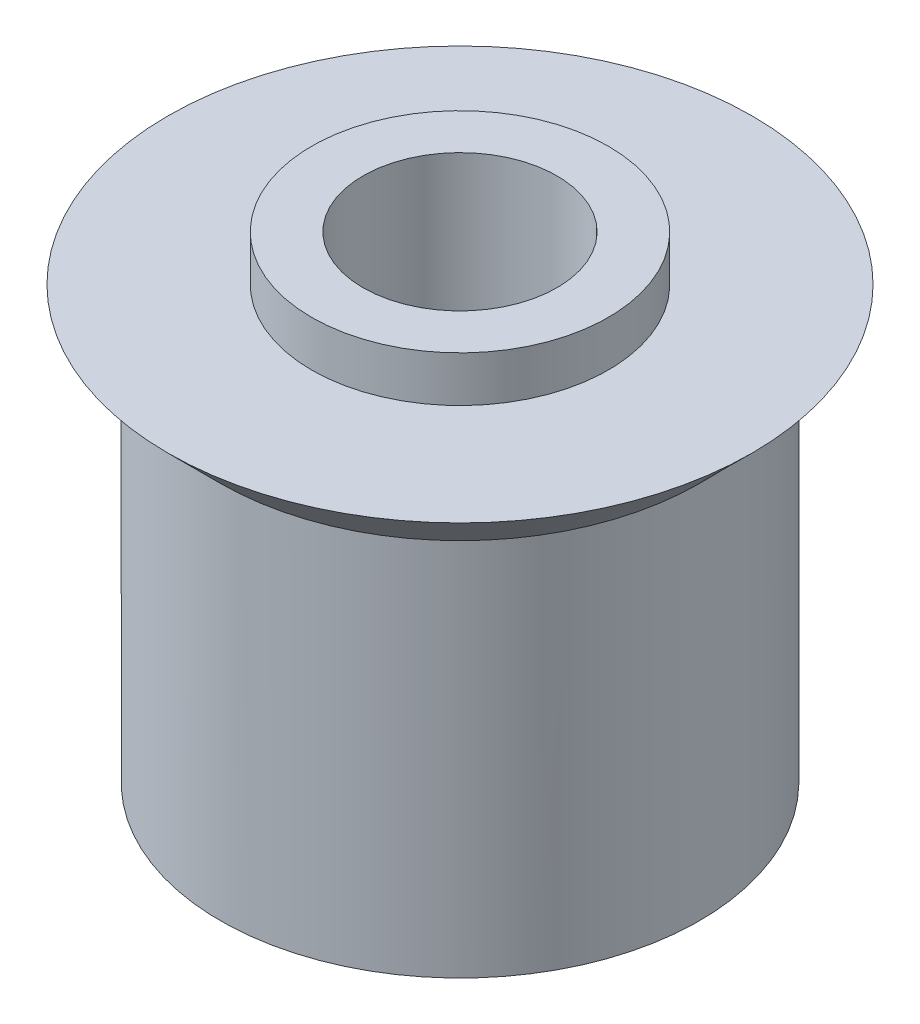
ISO-10303-21;
HEADER;
FILE_DESCRIPTION(('STEP AP214'),'2;1');
FILE_NAME('part.step','',(''),(''),'','','');
FILE_SCHEMA(('AUTOMOTIVE_DESIGN { 1 0 10303 214 1 1 1 1 }'));
ENDSEC;
DATA;
#1=APPLICATION_CONTEXT('core data for automotive mechanical design processes');
#2=APPLICATION_PROTOCOL_DEFINITION('international standard','automotive_design',2000,#1);
#3=PRODUCT_CONTEXT('',#1,'mechanical');
#4=PRODUCT('Part','Part','',(#3));
#5=PRODUCT_RELATED_PRODUCT_CATEGORY('part','',(#4));
#6=PRODUCT_DEFINITION_FORMATION('','',#4);
#7=PRODUCT_DEFINITION_CONTEXT('part definition',#1,'design');
#8=PRODUCT_DEFINITION('design','',#6,#7);
#9=PRODUCT_DEFINITION_SHAPE('','',#8);
#10=(LENGTH_UNIT() NAMED_UNIT(*) SI_UNIT(.MILLI.,.METRE.));
#11=(NAMED_UNIT(*) PLANE_ANGLE_UNIT() SI_UNIT($,.RADIAN.));
#12=(NAMED_UNIT(*) SI_UNIT($,.STERADIAN.) SOLID_ANGLE_UNIT());
#13=UNCERTAINTY_MEASURE_WITH_UNIT(LENGTH_MEASURE(1.E-05),#10,'distance_accuracy_value','');
#14=(GEOMETRIC_REPRESENTATION_CONTEXT(3) GLOBAL_UNCERTAINTY_ASSIGNED_CONTEXT((#13)) GLOBAL_UNIT_ASSIGNED_CONTEXT((#10,
#11,#12)) REPRESENTATION_CONTEXT('',''));
#15=CARTESIAN_POINT('',(0.,0.,0.));
#16=DIRECTION('',(0.,0.,1.));
#17=DIRECTION('',(1.,0.,0.));
#18=AXIS2_PLACEMENT_3D('',#15,#16,#17);
#19=CARTESIAN_POINT('',(0.,18.9,0.));
#20=DIRECTION('',(0.,1.,0.));
#21=DIRECTION('',(0.,0.,1.));
#22=AXIS2_PLACEMENT_3D('',#19,#20,#21);
#23=PLANE('',#22);
#24=CARTESIAN_POINT('',(0.,18.9,0.));
#25=DIRECTION('',(0.,1.,0.));
#26=DIRECTION('',(0.,0.,1.));
#27=AXIS2_PLACEMENT_3D('',#24,#25,#26);
#28=CIRCLE('',#27,6.5);
#29=CARTESIAN_POINT('',(0.,18.9,6.5));
#30=VERTEX_POINT('',#29);
#31=EDGE_CURVE('E45',#30,#30,#28,.T.);
#32=ORIENTED_EDGE('',*,*,#31,.F.);
#33=EDGE_LOOP('',(#32));
#34=FACE_BOUND('',#33,.T.);
#35=CARTESIAN_POINT('',(0.,18.9,0.));
#36=DIRECTION('',(0.,-1.,0.));
#37=DIRECTION('',(0.,0.,-1.));
#38=AXIS2_PLACEMENT_3D('',#35,#36,#37);
#39=CIRCLE('',#38,12.8);
#40=CARTESIAN_POINT('',(0.,18.9,-12.8));
#41=VERTEX_POINT('',#40);
#42=EDGE_CURVE('E50',#41,#41,#39,.T.);
#43=ORIENTED_EDGE('',*,*,#42,.F.);
#44=EDGE_LOOP('',(#43));
#45=FACE_BOUND('',#44,.T.);
#46=ADVANCED_FACE('F36',(#34,#45),#23,.T.);
#47=CARTESIAN_POINT('',(0.,15.5,0.));
#48=DIRECTION('',(0.,1.,0.));
#49=DIRECTION('',(0.,0.,1.));
#50=AXIS2_PLACEMENT_3D('',#47,#48,#49);
#51=CONICAL_SURFACE('',#50,9.4,0.785398163397448);
#52=CARTESIAN_POINT('',(0.,16.6,0.));
#53=DIRECTION('',(0.,1.,0.));
#54=DIRECTION('',(0.,0.,1.));
#55=AXIS2_PLACEMENT_3D('',#52,#53,#54);
#56=CIRCLE('',#55,10.5);
#57=CARTESIAN_POINT('',(0.,16.6,10.5));
#58=VERTEX_POINT('',#57);
#59=EDGE_CURVE('E10',#58,#58,#56,.F.);
#60=ORIENTED_EDGE('',*,*,#59,.F.);
#61=EDGE_LOOP('',(#60));
#62=FACE_BOUND('',#61,.T.);
#63=ORIENTED_EDGE('',*,*,#42,.T.);
#64=EDGE_LOOP('',(#63));
#65=FACE_BOUND('',#64,.T.);
#66=ADVANCED_FACE('F84',(#62,#65),#51,.T.);
#67=CARTESIAN_POINT('',(0.,20.9,0.));
#68=DIRECTION('',(0.,-1.,0.));
#69=DIRECTION('',(0.,0.,-1.));
#70=AXIS2_PLACEMENT_3D('',#67,#68,#69);
#71=CYLINDRICAL_SURFACE('',#70,6.5);
#72=CARTESIAN_POINT('',(0.,20.9,0.));
#73=DIRECTION('',(0.,1.,0.));
#74=DIRECTION('',(0.,0.,1.));
#75=AXIS2_PLACEMENT_3D('',#72,#73,#74);
#76=CIRCLE('',#75,6.5);
#77=CARTESIAN_POINT('',(0.,20.9,6.5));
#78=VERTEX_POINT('',#77);
#79=EDGE_CURVE('E55',#78,#78,#76,.T.);
#80=ORIENTED_EDGE('',*,*,#79,.F.);
#81=EDGE_LOOP('',(#80));
#82=FACE_BOUND('',#81,.T.);
#83=ORIENTED_EDGE('',*,*,#31,.T.);
#84=EDGE_LOOP('',(#83));
#85=FACE_BOUND('',#84,.T.);
#86=ADVANCED_FACE('F89',(#82,#85),#71,.T.);
#87=CARTESIAN_POINT('',(0.,20.9,0.));
#88=DIRECTION('',(0.,1.,0.));
#89=DIRECTION('',(0.,0.,1.));
#90=AXIS2_PLACEMENT_3D('',#87,#88,#89);
#91=PLANE('',#90);
#92=CARTESIAN_POINT('',(0.,20.9,0.));
#93=DIRECTION('',(0.,1.,0.));
#94=DIRECTION('',(0.,0.,1.));
#95=AXIS2_PLACEMENT_3D('',#92,#93,#94);
#96=CIRCLE('',#95,4.25);
#97=CARTESIAN_POINT('',(0.,20.9,4.25));
#98=VERTEX_POINT('',#97);
#99=EDGE_CURVE('E64',#98,#98,#96,.T.);
#100=ORIENTED_EDGE('',*,*,#99,.F.);
#101=EDGE_LOOP('',(#100));
#102=FACE_BOUND('',#101,.T.);
#103=ORIENTED_EDGE('',*,*,#79,.T.);
#104=EDGE_LOOP('',(#103));
#105=FACE_BOUND('',#104,.T.);
#106=ADVANCED_FACE('F97',(#102,#105),#91,.T.);
#107=CARTESIAN_POINT('',(0.,17.,0.));
#108=DIRECTION('',(0.,-1.,0.));
#109=DIRECTION('',(0.,0.,-1.));
#110=AXIS2_PLACEMENT_3D('',#107,#108,#109);
#111=CYLINDRICAL_SURFACE('',#110,10.5);
#112=ORIENTED_EDGE('',*,*,#59,.T.);
#113=EDGE_LOOP('',(#112));
#114=FACE_BOUND('',#113,.T.);
#115=CARTESIAN_POINT('',(0.,0.,0.));
#116=DIRECTION('',(0.,-1.,0.));
#117=DIRECTION('',(0.,0.,-1.));
#118=AXIS2_PLACEMENT_3D('',#115,#116,#117);
#119=CIRCLE('',#118,10.5);
#120=CARTESIAN_POINT('',(0.,0.,-10.5));
#121=VERTEX_POINT('',#120);
#122=EDGE_CURVE('E60',#121,#121,#119,.T.);
#123=ORIENTED_EDGE('',*,*,#122,.F.);
#124=EDGE_LOOP('',(#123));
#125=FACE_BOUND('',#124,.T.);
#126=ADVANCED_FACE('F81',(#114,#125),#111,.T.);
#127=CARTESIAN_POINT('',(0.,0.,0.));
#128=DIRECTION('',(0.,1.,0.));
#129=DIRECTION('',(0.,0.,1.));
#130=AXIS2_PLACEMENT_3D('',#127,#128,#129);
#131=PLANE('',#130);
#132=CARTESIAN_POINT('',(0.,0.,0.));
#133=DIRECTION('',(0.,1.,0.));
#134=DIRECTION('',(0.,0.,1.));
#135=AXIS2_PLACEMENT_3D('',#132,#133,#134);
#136=CIRCLE('',#135,4.25);
#137=CARTESIAN_POINT('',(0.,0.,4.25));
#138=VERTEX_POINT('',#137);
#139=EDGE_CURVE('E40',#138,#138,#136,.T.);
#140=ORIENTED_EDGE('',*,*,#139,.T.);
#141=EDGE_LOOP('',(#140));
#142=FACE_BOUND('',#141,.T.);
#143=ORIENTED_EDGE('',*,*,#122,.T.);
#144=EDGE_LOOP('',(#143));
#145=FACE_BOUND('',#144,.T.);
#146=ADVANCED_FACE('F38',(#142,#145),#131,.F.);
#147=CARTESIAN_POINT('',(0.,-10.1,0.));
#148=DIRECTION('',(0.,1.,0.));
#149=DIRECTION('',(0.,0.,1.));
#150=AXIS2_PLACEMENT_3D('',#147,#148,#149);
#151=CYLINDRICAL_SURFACE('',#150,4.25);
#152=ORIENTED_EDGE('',*,*,#99,.T.);
#153=EDGE_LOOP('',(#152));
#154=FACE_BOUND('',#153,.T.);
#155=ORIENTED_EDGE('',*,*,#139,.F.);
#156=EDGE_LOOP('',(#155));
#157=FACE_BOUND('',#156,.T.);
#158=ADVANCED_FACE('F75',(#154,#157),#151,.F.);
#159=CLOSED_SHELL('',(#46,#66,#86,#106,#126,#146,#158));
#160=MANIFOLD_SOLID_BREP('B2',#159);
#161=ADVANCED_BREP_SHAPE_REPRESENTATION('',(#18,#160),#14);
#162=SHAPE_DEFINITION_REPRESENTATION(#9,#161);
ENDSEC;
END-ISO-10303-21;
